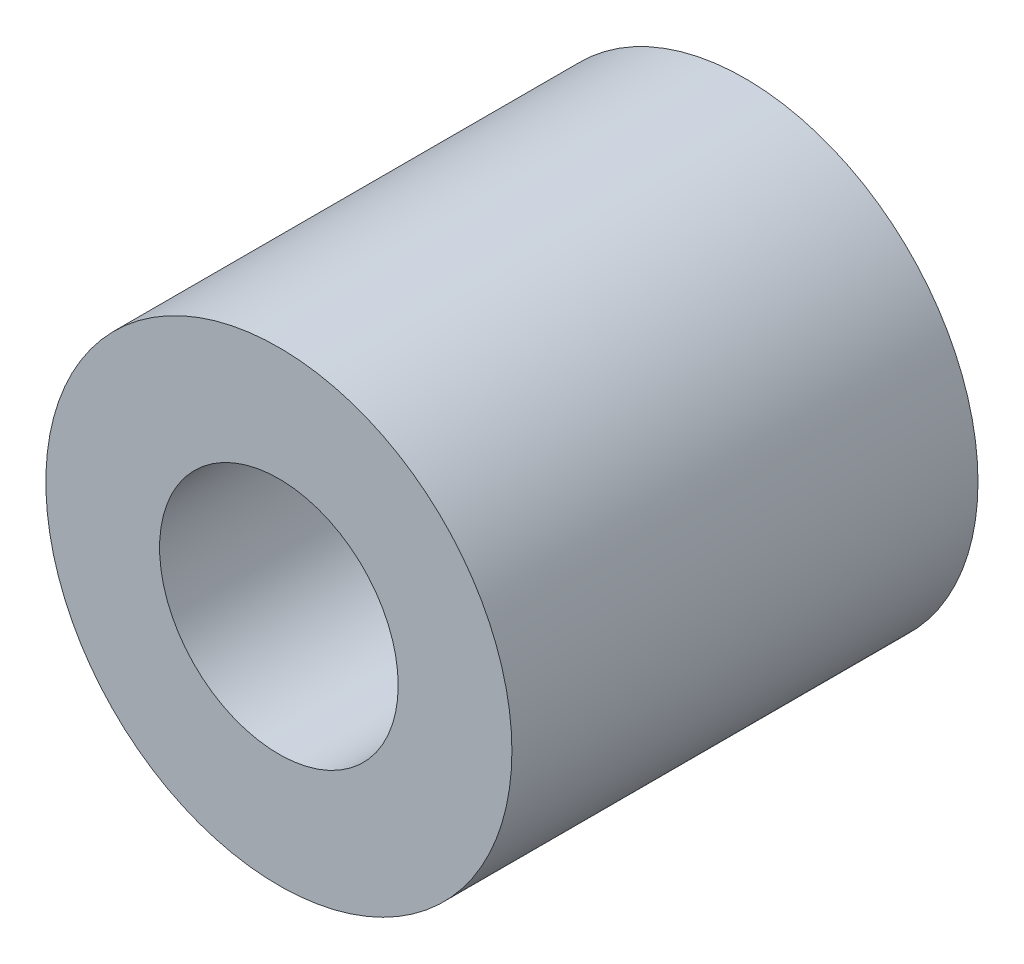
ISO-10303-21;
HEADER;
FILE_DESCRIPTION(('STEP AP214'),'2;1');
FILE_NAME('part.step','',(''),(''),'','','');
FILE_SCHEMA(('AUTOMOTIVE_DESIGN { 1 0 10303 214 1 1 1 1 }'));
ENDSEC;
DATA;
#1=APPLICATION_CONTEXT('core data for automotive mechanical design processes');
#2=APPLICATION_PROTOCOL_DEFINITION('international standard','automotive_design',2000,#1);
#3=PRODUCT_CONTEXT('',#1,'mechanical');
#4=PRODUCT('Part','Part','',(#3));
#5=PRODUCT_RELATED_PRODUCT_CATEGORY('part','',(#4));
#6=PRODUCT_DEFINITION_FORMATION('','',#4);
#7=PRODUCT_DEFINITION_CONTEXT('part definition',#1,'design');
#8=PRODUCT_DEFINITION('design','',#6,#7);
#9=PRODUCT_DEFINITION_SHAPE('','',#8);
#10=(LENGTH_UNIT() NAMED_UNIT(*) SI_UNIT(.MILLI.,.METRE.));
#11=(NAMED_UNIT(*) PLANE_ANGLE_UNIT() SI_UNIT($,.RADIAN.));
#12=(NAMED_UNIT(*) SI_UNIT($,.STERADIAN.) SOLID_ANGLE_UNIT());
#13=UNCERTAINTY_MEASURE_WITH_UNIT(LENGTH_MEASURE(1.E-05),#10,'distance_accuracy_value','');
#14=(GEOMETRIC_REPRESENTATION_CONTEXT(3) GLOBAL_UNCERTAINTY_ASSIGNED_CONTEXT((#13)) GLOBAL_UNIT_ASSIGNED_CONTEXT((#10,
#11,#12)) REPRESENTATION_CONTEXT('',''));
#15=CARTESIAN_POINT('',(0.,0.,0.));
#16=DIRECTION('',(0.,0.,1.));
#17=DIRECTION('',(1.,0.,0.));
#18=AXIS2_PLACEMENT_3D('',#15,#16,#17);
#19=CARTESIAN_POINT('',(0.,0.,1.5875));
#20=DIRECTION('',(0.,0.,1.));
#21=DIRECTION('',(1.,0.,0.));
#22=AXIS2_PLACEMENT_3D('',#19,#20,#21);
#23=PLANE('',#22);
#24=CARTESIAN_POINT('',(0.,0.,1.5875));
#25=DIRECTION('',(0.,0.,1.));
#26=DIRECTION('',(1.,0.,0.));
#27=AXIS2_PLACEMENT_3D('',#24,#25,#26);
#28=CIRCLE('',#27,1.5875);
#29=CARTESIAN_POINT('',(1.5875,0.,1.5875));
#30=VERTEX_POINT('',#29);
#31=EDGE_CURVE('E10',#30,#30,#28,.T.);
#32=ORIENTED_EDGE('',*,*,#31,.T.);
#33=EDGE_LOOP('',(#32));
#34=FACE_BOUND('',#33,.T.);
#35=CARTESIAN_POINT('',(0.,0.,1.5875));
#36=DIRECTION('',(0.,0.,1.));
#37=DIRECTION('',(1.,0.,0.));
#38=AXIS2_PLACEMENT_3D('',#35,#36,#37);
#39=CIRCLE('',#38,0.8128);
#40=CARTESIAN_POINT('',(0.8128,0.,1.5875));
#41=VERTEX_POINT('',#40);
#42=EDGE_CURVE('E43',#41,#41,#39,.T.);
#43=ORIENTED_EDGE('',*,*,#42,.F.);
#44=EDGE_LOOP('',(#43));
#45=FACE_BOUND('',#44,.T.);
#46=ADVANCED_FACE('F32',(#34,#45),#23,.T.);
#47=CARTESIAN_POINT('',(0.,0.,-1.5875));
#48=DIRECTION('',(0.,0.,1.));
#49=DIRECTION('',(1.,0.,0.));
#50=AXIS2_PLACEMENT_3D('',#47,#48,#49);
#51=PLANE('',#50);
#52=CARTESIAN_POINT('',(0.,0.,-1.5875));
#53=DIRECTION('',(0.,0.,1.));
#54=DIRECTION('',(1.,0.,0.));
#55=AXIS2_PLACEMENT_3D('',#52,#53,#54);
#56=CIRCLE('',#55,1.5875);
#57=CARTESIAN_POINT('',(1.5875,0.,-1.5875));
#58=VERTEX_POINT('',#57);
#59=EDGE_CURVE('E36',#58,#58,#56,.T.);
#60=ORIENTED_EDGE('',*,*,#59,.F.);
#61=EDGE_LOOP('',(#60));
#62=FACE_BOUND('',#61,.T.);
#63=CARTESIAN_POINT('',(0.,0.,-1.5875));
#64=DIRECTION('',(0.,0.,1.));
#65=DIRECTION('',(1.,0.,0.));
#66=AXIS2_PLACEMENT_3D('',#63,#64,#65);
#67=CIRCLE('',#66,0.8128);
#68=CARTESIAN_POINT('',(0.8128,0.,-1.5875));
#69=VERTEX_POINT('',#68);
#70=EDGE_CURVE('E45',#69,#69,#67,.T.);
#71=ORIENTED_EDGE('',*,*,#70,.T.);
#72=EDGE_LOOP('',(#71));
#73=FACE_BOUND('',#72,.T.);
#74=ADVANCED_FACE('F55',(#62,#73),#51,.F.);
#75=CARTESIAN_POINT('',(0.,0.,1.5875));
#76=DIRECTION('',(0.,0.,-1.));
#77=DIRECTION('',(-1.,0.,0.));
#78=AXIS2_PLACEMENT_3D('',#75,#76,#77);
#79=CYLINDRICAL_SURFACE('',#78,1.5875);
#80=ORIENTED_EDGE('',*,*,#31,.F.);
#81=EDGE_LOOP('',(#80));
#82=FACE_BOUND('',#81,.T.);
#83=ORIENTED_EDGE('',*,*,#59,.T.);
#84=EDGE_LOOP('',(#83));
#85=FACE_BOUND('',#84,.T.);
#86=ADVANCED_FACE('F34',(#82,#85),#79,.T.);
#87=CARTESIAN_POINT('',(0.,0.,1.5875));
#88=DIRECTION('',(0.,0.,-1.));
#89=DIRECTION('',(-1.,0.,0.));
#90=AXIS2_PLACEMENT_3D('',#87,#88,#89);
#91=CYLINDRICAL_SURFACE('',#90,0.8128);
#92=ORIENTED_EDGE('',*,*,#42,.T.);
#93=EDGE_LOOP('',(#92));
#94=FACE_BOUND('',#93,.T.);
#95=ORIENTED_EDGE('',*,*,#70,.F.);
#96=EDGE_LOOP('',(#95));
#97=FACE_BOUND('',#96,.T.);
#98=ADVANCED_FACE('F51',(#94,#97),#91,.F.);
#99=CLOSED_SHELL('',(#46,#74,#86,#98));
#100=MANIFOLD_SOLID_BREP('B2',#99);
#101=ADVANCED_BREP_SHAPE_REPRESENTATION('',(#18,#100),#14);
#102=SHAPE_DEFINITION_REPRESENTATION(#9,#101);
ENDSEC;
END-ISO-10303-21;
